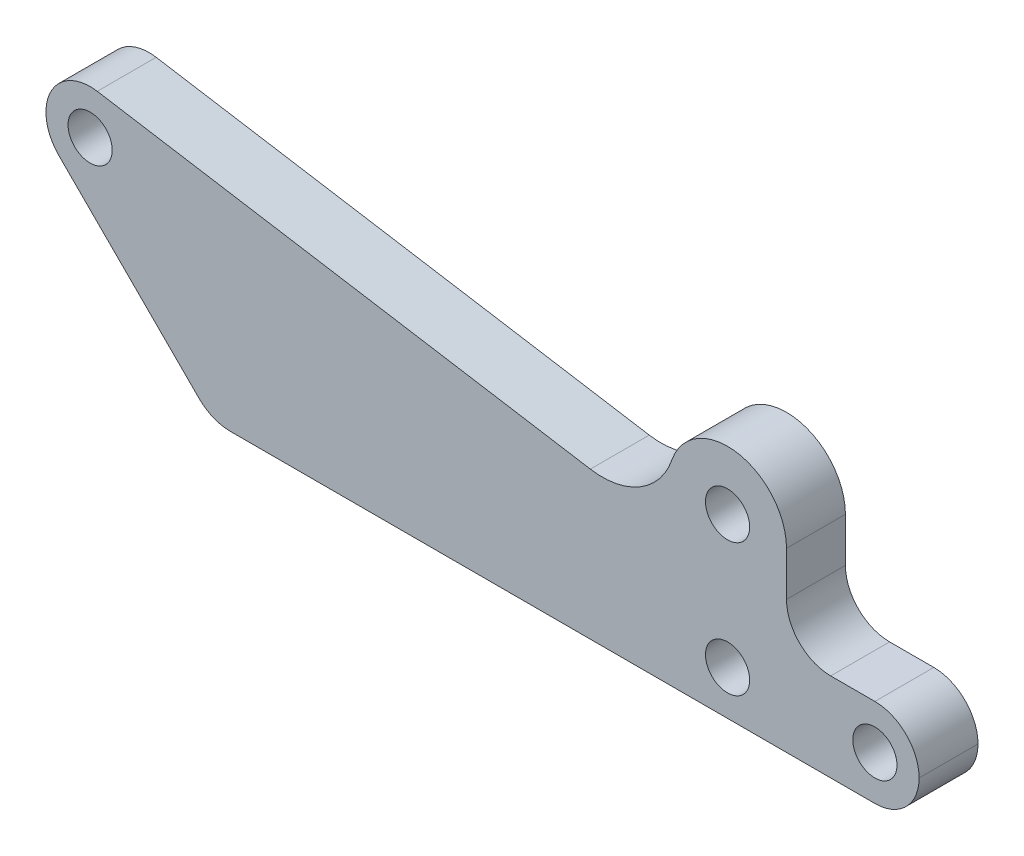
ISO-10303-21;
HEADER;
FILE_DESCRIPTION(('STEP AP214'),'2;1');
FILE_NAME('part.step','',(''),(''),'','','');
FILE_SCHEMA(('AUTOMOTIVE_DESIGN { 1 0 10303 214 1 1 1 1 }'));
ENDSEC;
DATA;
#1=APPLICATION_CONTEXT('core data for automotive mechanical design processes');
#2=APPLICATION_PROTOCOL_DEFINITION('international standard','automotive_design',2000,#1);
#3=PRODUCT_CONTEXT('',#1,'mechanical');
#4=PRODUCT('Part','Part','',(#3));
#5=PRODUCT_RELATED_PRODUCT_CATEGORY('part','',(#4));
#6=PRODUCT_DEFINITION_FORMATION('','',#4);
#7=PRODUCT_DEFINITION_CONTEXT('part definition',#1,'design');
#8=PRODUCT_DEFINITION('design','',#6,#7);
#9=PRODUCT_DEFINITION_SHAPE('','',#8);
#10=(LENGTH_UNIT() NAMED_UNIT(*) SI_UNIT(.MILLI.,.METRE.));
#11=(NAMED_UNIT(*) PLANE_ANGLE_UNIT() SI_UNIT($,.RADIAN.));
#12=(NAMED_UNIT(*) SI_UNIT($,.STERADIAN.) SOLID_ANGLE_UNIT());
#13=UNCERTAINTY_MEASURE_WITH_UNIT(LENGTH_MEASURE(1.E-05),#10,'distance_accuracy_value','');
#14=(GEOMETRIC_REPRESENTATION_CONTEXT(3) GLOBAL_UNCERTAINTY_ASSIGNED_CONTEXT((#13)) GLOBAL_UNIT_ASSIGNED_CONTEXT((#10,
#11,#12)) REPRESENTATION_CONTEXT('',''));
#15=CARTESIAN_POINT('',(0.,0.,0.));
#16=DIRECTION('',(0.,0.,1.));
#17=DIRECTION('',(1.,0.,0.));
#18=AXIS2_PLACEMENT_3D('',#15,#16,#17);
#19=CARTESIAN_POINT('',(-8.27098450185369,12.5136251889729,4.));
#20=DIRECTION('',(0.,0.,-1.));
#21=DIRECTION('',(-1.,0.,0.));
#22=AXIS2_PLACEMENT_3D('',#19,#20,#21);
#23=PLANE('',#22);
#24=DIRECTION('',(1.,0.,0.));
#25=VECTOR('',#24,1.);
#26=CARTESIAN_POINT('',(0.,0.,4.));
#27=LINE('',#26,#25);
#28=CARTESIAN_POINT('',(1.24264068711927,0.,4.));
#29=VERTEX_POINT('',#28);
#30=CARTESIAN_POINT('',(45.,0.,4.));
#31=VERTEX_POINT('',#30);
#32=EDGE_CURVE('E280',#29,#31,#27,.T.);
#33=ORIENTED_EDGE('',*,*,#32,.T.);
#34=CARTESIAN_POINT('',(45.,3.,4.));
#35=DIRECTION('',(0.,0.,-1.));
#36=DIRECTION('',(-1.,0.,0.));
#37=AXIS2_PLACEMENT_3D('',#34,#35,#36);
#38=CIRCLE('',#37,3.);
#39=CARTESIAN_POINT('',(48.,3.,4.));
#40=VERTEX_POINT('',#39);
#41=EDGE_CURVE('E198',#31,#40,#38,.F.);
#42=ORIENTED_EDGE('',*,*,#41,.T.);
#43=CARTESIAN_POINT('',(45.,3.,4.));
#44=DIRECTION('',(0.,0.,-1.));
#45=DIRECTION('',(-1.,0.,0.));
#46=AXIS2_PLACEMENT_3D('',#43,#44,#45);
#47=CIRCLE('',#46,3.);
#48=CARTESIAN_POINT('',(45.,6.,4.));
#49=VERTEX_POINT('',#48);
#50=EDGE_CURVE('E196',#40,#49,#47,.F.);
#51=ORIENTED_EDGE('',*,*,#50,.T.);
#52=DIRECTION('',(-1.,0.,0.));
#53=VECTOR('',#52,1.);
#54=CARTESIAN_POINT('',(39.,6.,4.));
#55=LINE('',#54,#53);
#56=CARTESIAN_POINT('',(42.,6.,4.));
#57=VERTEX_POINT('',#56);
#58=EDGE_CURVE('E130',#49,#57,#55,.T.);
#59=ORIENTED_EDGE('',*,*,#58,.T.);
#60=CARTESIAN_POINT('',(42.,9.,4.));
#61=DIRECTION('',(0.,0.,-1.));
#62=DIRECTION('',(-1.,0.,0.));
#63=AXIS2_PLACEMENT_3D('',#60,#61,#62);
#64=CIRCLE('',#63,3.);
#65=CARTESIAN_POINT('',(39.,9.,4.));
#66=VERTEX_POINT('',#65);
#67=EDGE_CURVE('E11',#57,#66,#64,.T.);
#68=ORIENTED_EDGE('',*,*,#67,.T.);
#69=DIRECTION('',(0.,1.,0.));
#70=VECTOR('',#69,1.);
#71=CARTESIAN_POINT('',(39.,6.,4.));
#72=LINE('',#71,#70);
#73=CARTESIAN_POINT('',(39.,12.,4.));
#74=VERTEX_POINT('',#73);
#75=EDGE_CURVE('E120',#66,#74,#72,.T.);
#76=ORIENTED_EDGE('',*,*,#75,.T.);
#77=CARTESIAN_POINT('',(35.,12.,4.));
#78=DIRECTION('',(0.,0.,1.));
#79=DIRECTION('',(-1.,0.,0.));
#80=AXIS2_PLACEMENT_3D('',#77,#78,#79);
#81=CIRCLE('',#80,4.);
#82=CARTESIAN_POINT('',(31.2185884329908,13.3041957525193,4.));
#83=VERTEX_POINT('',#82);
#84=EDGE_CURVE('E125',#74,#83,#81,.T.);
#85=ORIENTED_EDGE('',*,*,#84,.T.);
#86=CARTESIAN_POINT('',(26.4918239742295,14.9344404431683,4.));
#87=DIRECTION('',(0.,0.,-1.));
#88=DIRECTION('',(1.,0.,0.));
#89=AXIS2_PLACEMENT_3D('',#86,#87,#88);
#90=CIRCLE('',#89,4.99999999999986);
#91=CARTESIAN_POINT('',(25.6847939172777,10.,4.));
#92=VERTEX_POINT('',#91);
#93=EDGE_CURVE('E145',#83,#92,#90,.T.);
#94=ORIENTED_EDGE('',*,*,#93,.T.);
#95=DIRECTION('',(-0.986888088633688,0.161406011390361,0.));
#96=VECTOR('',#95,1.);
#97=CARTESIAN_POINT('',(-7.78676646768261,15.4742894548739,4.));
#98=LINE('',#97,#96);
#99=CARTESIAN_POINT('',(-7.78676646768261,15.4742894548739,4.));
#100=VERTEX_POINT('',#99);
#101=EDGE_CURVE('E147',#92,#100,#98,.T.);
#102=ORIENTED_EDGE('',*,*,#101,.T.);
#103=CARTESIAN_POINT('',(-8.27098450185369,12.5136251889729,4.));
#104=DIRECTION('',(0.,0.,1.));
#105=DIRECTION('',(-1.,0.,0.));
#106=AXIS2_PLACEMENT_3D('',#103,#104,#105);
#107=CIRCLE('',#106,3.);
#108=CARTESIAN_POINT('',(-10.3923048454133,10.3923048454132,4.));
#109=VERTEX_POINT('',#108);
#110=EDGE_CURVE('E152',#100,#109,#107,.T.);
#111=ORIENTED_EDGE('',*,*,#110,.T.);
#112=DIRECTION('',(0.707106781186552,-0.707106781186543,0.));
#113=VECTOR('',#112,1.);
#114=CARTESIAN_POINT('',(0.,0.,4.));
#115=LINE('',#114,#113);
#116=CARTESIAN_POINT('',(-0.878679656440355,0.878679656440345,4.));
#117=VERTEX_POINT('',#116);
#118=EDGE_CURVE('E173',#109,#117,#115,.T.);
#119=ORIENTED_EDGE('',*,*,#118,.T.);
#120=CARTESIAN_POINT('',(1.24264068711927,3.,4.));
#121=DIRECTION('',(0.,0.,-1.));
#122=DIRECTION('',(-1.,0.,0.));
#123=AXIS2_PLACEMENT_3D('',#120,#121,#122);
#124=CIRCLE('',#123,3.);
#125=EDGE_CURVE('E194',#117,#29,#124,.F.);
#126=ORIENTED_EDGE('',*,*,#125,.T.);
#127=EDGE_LOOP('',(#33,#42,#51,#59,#68,#76,#85,#94,#102,#111,#119,#126));
#128=FACE_BOUND('',#127,.T.);
#129=CARTESIAN_POINT('',(35.,12.,4.));
#130=DIRECTION('',(0.,0.,1.));
#131=DIRECTION('',(1.,0.,0.));
#132=AXIS2_PLACEMENT_3D('',#129,#130,#131);
#133=CIRCLE('',#132,1.5);
#134=CARTESIAN_POINT('',(36.5,12.,4.));
#135=VERTEX_POINT('',#134);
#136=EDGE_CURVE('E159',#135,#135,#133,.T.);
#137=ORIENTED_EDGE('',*,*,#136,.F.);
#138=EDGE_LOOP('',(#137));
#139=FACE_BOUND('',#138,.T.);
#140=CARTESIAN_POINT('',(-8.27098450185369,12.5136251889729,4.));
#141=DIRECTION('',(0.,0.,1.));
#142=DIRECTION('',(1.,0.,0.));
#143=AXIS2_PLACEMENT_3D('',#140,#141,#142);
#144=CIRCLE('',#143,1.50000000000001);
#145=CARTESIAN_POINT('',(-6.77098450185369,12.5136251889729,4.));
#146=VERTEX_POINT('',#145);
#147=EDGE_CURVE('E289',#146,#146,#144,.T.);
#148=ORIENTED_EDGE('',*,*,#147,.F.);
#149=EDGE_LOOP('',(#148));
#150=FACE_BOUND('',#149,.T.);
#151=CARTESIAN_POINT('',(35.,3.,4.));
#152=DIRECTION('',(0.,0.,1.));
#153=DIRECTION('',(1.,0.,0.));
#154=AXIS2_PLACEMENT_3D('',#151,#152,#153);
#155=CIRCLE('',#154,1.5);
#156=CARTESIAN_POINT('',(36.5,3.,4.));
#157=VERTEX_POINT('',#156);
#158=EDGE_CURVE('E295',#157,#157,#155,.T.);
#159=ORIENTED_EDGE('',*,*,#158,.F.);
#160=EDGE_LOOP('',(#159));
#161=FACE_BOUND('',#160,.T.);
#162=CARTESIAN_POINT('',(45.,3.,4.));
#163=DIRECTION('',(0.,0.,1.));
#164=DIRECTION('',(1.,0.,0.));
#165=AXIS2_PLACEMENT_3D('',#162,#163,#164);
#166=CIRCLE('',#165,1.5);
#167=CARTESIAN_POINT('',(46.5,3.,4.));
#168=VERTEX_POINT('',#167);
#169=EDGE_CURVE('E301',#168,#168,#166,.T.);
#170=ORIENTED_EDGE('',*,*,#169,.F.);
#171=EDGE_LOOP('',(#170));
#172=FACE_BOUND('',#171,.T.);
#173=ADVANCED_FACE('F33',(#128,#139,#150,#161,#172),#23,.F.);
#174=CARTESIAN_POINT('',(-8.27098450185369,12.5136251889729,0.));
#175=DIRECTION('',(0.,0.,-1.));
#176=DIRECTION('',(-1.,0.,0.));
#177=AXIS2_PLACEMENT_3D('',#174,#175,#176);
#178=PLANE('',#177);
#179=CARTESIAN_POINT('',(35.,3.,0.));
#180=DIRECTION('',(0.,0.,1.));
#181=DIRECTION('',(1.,0.,0.));
#182=AXIS2_PLACEMENT_3D('',#179,#180,#181);
#183=CIRCLE('',#182,1.5);
#184=CARTESIAN_POINT('',(36.5,3.,0.));
#185=VERTEX_POINT('',#184);
#186=EDGE_CURVE('E298',#185,#185,#183,.T.);
#187=ORIENTED_EDGE('',*,*,#186,.T.);
#188=EDGE_LOOP('',(#187));
#189=FACE_BOUND('',#188,.T.);
#190=CARTESIAN_POINT('',(35.,12.,0.));
#191=DIRECTION('',(0.,0.,1.));
#192=DIRECTION('',(1.,0.,0.));
#193=AXIS2_PLACEMENT_3D('',#190,#191,#192);
#194=CIRCLE('',#193,1.5);
#195=CARTESIAN_POINT('',(36.5,12.,0.));
#196=VERTEX_POINT('',#195);
#197=EDGE_CURVE('E286',#196,#196,#194,.T.);
#198=ORIENTED_EDGE('',*,*,#197,.T.);
#199=EDGE_LOOP('',(#198));
#200=FACE_BOUND('',#199,.T.);
#201=CARTESIAN_POINT('',(45.,3.,0.));
#202=DIRECTION('',(0.,0.,-1.));
#203=DIRECTION('',(-1.,0.,0.));
#204=AXIS2_PLACEMENT_3D('',#201,#202,#203);
#205=CIRCLE('',#204,3.);
#206=CARTESIAN_POINT('',(45.,6.,0.));
#207=VERTEX_POINT('',#206);
#208=CARTESIAN_POINT('',(48.,3.,0.));
#209=VERTEX_POINT('',#208);
#210=EDGE_CURVE('E184',#207,#209,#205,.T.);
#211=ORIENTED_EDGE('',*,*,#210,.T.);
#212=CARTESIAN_POINT('',(45.,3.,0.));
#213=DIRECTION('',(0.,0.,-1.));
#214=DIRECTION('',(-1.,0.,0.));
#215=AXIS2_PLACEMENT_3D('',#212,#213,#214);
#216=CIRCLE('',#215,3.);
#217=CARTESIAN_POINT('',(45.,0.,0.));
#218=VERTEX_POINT('',#217);
#219=EDGE_CURVE('E186',#209,#218,#216,.T.);
#220=ORIENTED_EDGE('',*,*,#219,.T.);
#221=DIRECTION('',(1.,0.,0.));
#222=VECTOR('',#221,1.);
#223=CARTESIAN_POINT('',(0.,0.,0.));
#224=LINE('',#223,#222);
#225=CARTESIAN_POINT('',(1.24264068711927,0.,0.));
#226=VERTEX_POINT('',#225);
#227=EDGE_CURVE('E158',#226,#218,#224,.T.);
#228=ORIENTED_EDGE('',*,*,#227,.F.);
#229=CARTESIAN_POINT('',(1.24264068711927,3.,0.));
#230=DIRECTION('',(0.,0.,-1.));
#231=DIRECTION('',(-1.,0.,0.));
#232=AXIS2_PLACEMENT_3D('',#229,#230,#231);
#233=CIRCLE('',#232,3.);
#234=CARTESIAN_POINT('',(-0.878679656440355,0.878679656440345,0.));
#235=VERTEX_POINT('',#234);
#236=EDGE_CURVE('E139',#226,#235,#233,.T.);
#237=ORIENTED_EDGE('',*,*,#236,.T.);
#238=DIRECTION('',(0.707106781186552,-0.707106781186543,0.));
#239=VECTOR('',#238,1.);
#240=CARTESIAN_POINT('',(0.,0.,0.));
#241=LINE('',#240,#239);
#242=CARTESIAN_POINT('',(-10.3923048454133,10.3923048454132,0.));
#243=VERTEX_POINT('',#242);
#244=EDGE_CURVE('E155',#243,#235,#241,.T.);
#245=ORIENTED_EDGE('',*,*,#244,.F.);
#246=CARTESIAN_POINT('',(-8.27098450185369,12.5136251889729,0.));
#247=DIRECTION('',(0.,0.,1.));
#248=DIRECTION('',(-1.,0.,0.));
#249=AXIS2_PLACEMENT_3D('',#246,#247,#248);
#250=CIRCLE('',#249,3.);
#251=CARTESIAN_POINT('',(-7.78676646768261,15.4742894548739,0.));
#252=VERTEX_POINT('',#251);
#253=EDGE_CURVE('E171',#252,#243,#250,.T.);
#254=ORIENTED_EDGE('',*,*,#253,.F.);
#255=DIRECTION('',(-0.986888088633688,0.161406011390361,0.));
#256=VECTOR('',#255,1.);
#257=CARTESIAN_POINT('',(-7.78676646768261,15.4742894548739,0.));
#258=LINE('',#257,#256);
#259=CARTESIAN_POINT('',(25.6847939172777,10.,0.));
#260=VERTEX_POINT('',#259);
#261=EDGE_CURVE('E169',#260,#252,#258,.T.);
#262=ORIENTED_EDGE('',*,*,#261,.F.);
#263=CARTESIAN_POINT('',(26.4918239742295,14.9344404431683,0.));
#264=DIRECTION('',(0.,0.,-1.));
#265=DIRECTION('',(1.,0.,0.));
#266=AXIS2_PLACEMENT_3D('',#263,#264,#265);
#267=CIRCLE('',#266,4.99999999999986);
#268=CARTESIAN_POINT('',(31.2185884329908,13.3041957525193,0.));
#269=VERTEX_POINT('',#268);
#270=EDGE_CURVE('E167',#269,#260,#267,.T.);
#271=ORIENTED_EDGE('',*,*,#270,.F.);
#272=CARTESIAN_POINT('',(35.,12.,0.));
#273=DIRECTION('',(0.,0.,1.));
#274=DIRECTION('',(-1.,0.,0.));
#275=AXIS2_PLACEMENT_3D('',#272,#273,#274);
#276=CIRCLE('',#275,4.);
#277=CARTESIAN_POINT('',(39.,12.,0.));
#278=VERTEX_POINT('',#277);
#279=EDGE_CURVE('E165',#278,#269,#276,.T.);
#280=ORIENTED_EDGE('',*,*,#279,.F.);
#281=DIRECTION('',(0.,1.,0.));
#282=VECTOR('',#281,1.);
#283=CARTESIAN_POINT('',(39.,6.,0.));
#284=LINE('',#283,#282);
#285=CARTESIAN_POINT('',(39.,9.,0.));
#286=VERTEX_POINT('',#285);
#287=EDGE_CURVE('E136',#286,#278,#284,.T.);
#288=ORIENTED_EDGE('',*,*,#287,.F.);
#289=CARTESIAN_POINT('',(42.,9.,0.));
#290=DIRECTION('',(0.,0.,-1.));
#291=DIRECTION('',(-1.,0.,0.));
#292=AXIS2_PLACEMENT_3D('',#289,#290,#291);
#293=CIRCLE('',#292,3.);
#294=CARTESIAN_POINT('',(42.,6.,0.));
#295=VERTEX_POINT('',#294);
#296=EDGE_CURVE('E42',#286,#295,#293,.F.);
#297=ORIENTED_EDGE('',*,*,#296,.T.);
#298=DIRECTION('',(-1.,0.,0.));
#299=VECTOR('',#298,1.);
#300=CARTESIAN_POINT('',(39.,6.,0.));
#301=LINE('',#300,#299);
#302=EDGE_CURVE('E162',#207,#295,#301,.T.);
#303=ORIENTED_EDGE('',*,*,#302,.F.);
#304=EDGE_LOOP('',(#211,#220,#228,#237,#245,#254,#262,#271,#280,#288,#297,#303));
#305=FACE_BOUND('',#304,.T.);
#306=CARTESIAN_POINT('',(-8.27098450185369,12.5136251889729,0.));
#307=DIRECTION('',(0.,0.,1.));
#308=DIRECTION('',(1.,0.,0.));
#309=AXIS2_PLACEMENT_3D('',#306,#307,#308);
#310=CIRCLE('',#309,1.50000000000001);
#311=CARTESIAN_POINT('',(-6.77098450185369,12.5136251889729,0.));
#312=VERTEX_POINT('',#311);
#313=EDGE_CURVE('E292',#312,#312,#310,.T.);
#314=ORIENTED_EDGE('',*,*,#313,.T.);
#315=EDGE_LOOP('',(#314));
#316=FACE_BOUND('',#315,.T.);
#317=CARTESIAN_POINT('',(45.,3.,0.));
#318=DIRECTION('',(0.,0.,1.));
#319=DIRECTION('',(1.,0.,0.));
#320=AXIS2_PLACEMENT_3D('',#317,#318,#319);
#321=CIRCLE('',#320,1.5);
#322=CARTESIAN_POINT('',(46.5,3.,0.));
#323=VERTEX_POINT('',#322);
#324=EDGE_CURVE('E304',#323,#323,#321,.T.);
#325=ORIENTED_EDGE('',*,*,#324,.T.);
#326=EDGE_LOOP('',(#325));
#327=FACE_BOUND('',#326,.T.);
#328=ADVANCED_FACE('F209',(#189,#200,#305,#316,#327),#178,.T.);
#329=CARTESIAN_POINT('',(0.,0.,4.));
#330=DIRECTION('',(0.707106781186543,0.707106781186552,0.));
#331=DIRECTION('',(-0.707106781186552,0.707106781186543,0.));
#332=AXIS2_PLACEMENT_3D('',#329,#330,#331);
#333=PLANE('',#332);
#334=ORIENTED_EDGE('',*,*,#244,.T.);
#335=DIRECTION('',(0.,0.,-1.));
#336=VECTOR('',#335,1.);
#337=CARTESIAN_POINT('',(-0.878679656440355,0.878679656440345,4.));
#338=LINE('',#337,#336);
#339=EDGE_CURVE('E205',#235,#117,#338,.F.);
#340=ORIENTED_EDGE('',*,*,#339,.T.);
#341=ORIENTED_EDGE('',*,*,#118,.F.);
#342=DIRECTION('',(0.,0.,-1.));
#343=VECTOR('',#342,1.);
#344=CARTESIAN_POINT('',(-10.3923048454133,10.3923048454132,4.));
#345=LINE('',#344,#343);
#346=EDGE_CURVE('E154',#109,#243,#345,.T.);
#347=ORIENTED_EDGE('',*,*,#346,.T.);
#348=EDGE_LOOP('',(#334,#340,#341,#347));
#349=FACE_BOUND('',#348,.T.);
#350=ADVANCED_FACE('F232',(#349),#333,.F.);
#351=CARTESIAN_POINT('',(0.,0.,4.));
#352=DIRECTION('',(0.,1.,0.));
#353=DIRECTION('',(0.,0.,1.));
#354=AXIS2_PLACEMENT_3D('',#351,#352,#353);
#355=PLANE('',#354);
#356=ORIENTED_EDGE('',*,*,#227,.T.);
#357=DIRECTION('',(0.,0.,-1.));
#358=VECTOR('',#357,1.);
#359=CARTESIAN_POINT('',(45.,0.,4.));
#360=LINE('',#359,#358);
#361=EDGE_CURVE('E191',#218,#31,#360,.F.);
#362=ORIENTED_EDGE('',*,*,#361,.T.);
#363=ORIENTED_EDGE('',*,*,#32,.F.);
#364=DIRECTION('',(0.,0.,-1.));
#365=VECTOR('',#364,1.);
#366=CARTESIAN_POINT('',(1.24264068711927,0.,4.));
#367=LINE('',#366,#365);
#368=EDGE_CURVE('E188',#29,#226,#367,.T.);
#369=ORIENTED_EDGE('',*,*,#368,.T.);
#370=EDGE_LOOP('',(#356,#362,#363,#369));
#371=FACE_BOUND('',#370,.T.);
#372=ADVANCED_FACE('F257',(#371),#355,.F.);
#373=CARTESIAN_POINT('',(39.,6.,4.));
#374=DIRECTION('',(0.,-1.,0.));
#375=DIRECTION('',(0.,0.,-1.));
#376=AXIS2_PLACEMENT_3D('',#373,#374,#375);
#377=PLANE('',#376);
#378=ORIENTED_EDGE('',*,*,#58,.F.);
#379=DIRECTION('',(0.,0.,-1.));
#380=VECTOR('',#379,1.);
#381=CARTESIAN_POINT('',(45.,6.,4.));
#382=LINE('',#381,#380);
#383=EDGE_CURVE('E201',#49,#207,#382,.T.);
#384=ORIENTED_EDGE('',*,*,#383,.T.);
#385=ORIENTED_EDGE('',*,*,#302,.T.);
#386=DIRECTION('',(0.,0.,-1.));
#387=VECTOR('',#386,1.);
#388=CARTESIAN_POINT('',(42.,6.,4.));
#389=LINE('',#388,#387);
#390=EDGE_CURVE('E55',#295,#57,#389,.F.);
#391=ORIENTED_EDGE('',*,*,#390,.T.);
#392=EDGE_LOOP('',(#378,#384,#385,#391));
#393=FACE_BOUND('',#392,.T.);
#394=ADVANCED_FACE('F213',(#393),#377,.F.);
#395=CARTESIAN_POINT('',(39.,6.,4.));
#396=DIRECTION('',(-1.,0.,0.));
#397=DIRECTION('',(0.,-1.,0.));
#398=AXIS2_PLACEMENT_3D('',#395,#396,#397);
#399=PLANE('',#398);
#400=ORIENTED_EDGE('',*,*,#75,.F.);
#401=DIRECTION('',(0.,0.,-1.));
#402=VECTOR('',#401,1.);
#403=CARTESIAN_POINT('',(39.,9.,0.));
#404=LINE('',#403,#402);
#405=EDGE_CURVE('E203',#66,#286,#404,.T.);
#406=ORIENTED_EDGE('',*,*,#405,.T.);
#407=ORIENTED_EDGE('',*,*,#287,.T.);
#408=DIRECTION('',(0.,0.,-1.));
#409=VECTOR('',#408,1.);
#410=CARTESIAN_POINT('',(39.,12.,4.));
#411=LINE('',#410,#409);
#412=EDGE_CURVE('E133',#74,#278,#411,.T.);
#413=ORIENTED_EDGE('',*,*,#412,.F.);
#414=EDGE_LOOP('',(#400,#406,#407,#413));
#415=FACE_BOUND('',#414,.T.);
#416=ADVANCED_FACE('F134',(#415),#399,.F.);
#417=CARTESIAN_POINT('',(35.,12.,4.));
#418=DIRECTION('',(0.,0.,-1.));
#419=DIRECTION('',(-1.,0.,0.));
#420=AXIS2_PLACEMENT_3D('',#417,#418,#419);
#421=CYLINDRICAL_SURFACE('',#420,4.);
#422=ORIENTED_EDGE('',*,*,#279,.T.);
#423=DIRECTION('',(0.,0.,-1.));
#424=VECTOR('',#423,1.);
#425=CARTESIAN_POINT('',(31.2185884329908,13.3041957525193,4.));
#426=LINE('',#425,#424);
#427=EDGE_CURVE('E140',#83,#269,#426,.T.);
#428=ORIENTED_EDGE('',*,*,#427,.F.);
#429=ORIENTED_EDGE('',*,*,#84,.F.);
#430=ORIENTED_EDGE('',*,*,#412,.T.);
#431=EDGE_LOOP('',(#422,#428,#429,#430));
#432=FACE_BOUND('',#431,.T.);
#433=ADVANCED_FACE('F142',(#432),#421,.T.);
#434=CARTESIAN_POINT('',(26.4918239742295,14.9344404431683,4.));
#435=DIRECTION('',(0.,0.,-1.));
#436=DIRECTION('',(-1.,0.,0.));
#437=AXIS2_PLACEMENT_3D('',#434,#435,#436);
#438=CYLINDRICAL_SURFACE('',#437,4.99999999999986);
#439=ORIENTED_EDGE('',*,*,#270,.T.);
#440=DIRECTION('',(0.,0.,-1.));
#441=VECTOR('',#440,1.);
#442=CARTESIAN_POINT('',(25.6847939172777,10.,4.));
#443=LINE('',#442,#441);
#444=EDGE_CURVE('E179',#92,#260,#443,.T.);
#445=ORIENTED_EDGE('',*,*,#444,.F.);
#446=ORIENTED_EDGE('',*,*,#93,.F.);
#447=ORIENTED_EDGE('',*,*,#427,.T.);
#448=EDGE_LOOP('',(#439,#445,#446,#447));
#449=FACE_BOUND('',#448,.T.);
#450=ADVANCED_FACE('F246',(#449),#438,.F.);
#451=CARTESIAN_POINT('',(-7.78676646768261,15.4742894548739,4.));
#452=DIRECTION('',(-0.161406011390361,-0.986888088633688,0.));
#453=DIRECTION('',(0.986888088633688,-0.161406011390361,0.));
#454=AXIS2_PLACEMENT_3D('',#451,#452,#453);
#455=PLANE('',#454);
#456=ORIENTED_EDGE('',*,*,#261,.T.);
#457=DIRECTION('',(0.,0.,-1.));
#458=VECTOR('',#457,1.);
#459=CARTESIAN_POINT('',(-7.78676646768261,15.4742894548739,4.));
#460=LINE('',#459,#458);
#461=EDGE_CURVE('E176',#100,#252,#460,.T.);
#462=ORIENTED_EDGE('',*,*,#461,.F.);
#463=ORIENTED_EDGE('',*,*,#101,.F.);
#464=ORIENTED_EDGE('',*,*,#444,.T.);
#465=EDGE_LOOP('',(#456,#462,#463,#464));
#466=FACE_BOUND('',#465,.T.);
#467=ADVANCED_FACE('F242',(#466),#455,.F.);
#468=CARTESIAN_POINT('',(-8.27098450185369,12.5136251889729,4.));
#469=DIRECTION('',(0.,0.,-1.));
#470=DIRECTION('',(-1.,0.,0.));
#471=AXIS2_PLACEMENT_3D('',#468,#469,#470);
#472=CYLINDRICAL_SURFACE('',#471,3.);
#473=ORIENTED_EDGE('',*,*,#253,.T.);
#474=ORIENTED_EDGE('',*,*,#346,.F.);
#475=ORIENTED_EDGE('',*,*,#110,.F.);
#476=ORIENTED_EDGE('',*,*,#461,.T.);
#477=EDGE_LOOP('',(#473,#474,#475,#476));
#478=FACE_BOUND('',#477,.T.);
#479=ADVANCED_FACE('F239',(#478),#472,.T.);
#480=CARTESIAN_POINT('',(35.,12.,4.));
#481=DIRECTION('',(0.,0.,-1.));
#482=DIRECTION('',(-1.,0.,0.));
#483=AXIS2_PLACEMENT_3D('',#480,#481,#482);
#484=CYLINDRICAL_SURFACE('',#483,1.5);
#485=ORIENTED_EDGE('',*,*,#136,.T.);
#486=EDGE_LOOP('',(#485));
#487=FACE_BOUND('',#486,.T.);
#488=ORIENTED_EDGE('',*,*,#197,.F.);
#489=EDGE_LOOP('',(#488));
#490=FACE_BOUND('',#489,.T.);
#491=ADVANCED_FACE('F236',(#487,#490),#484,.F.);
#492=CARTESIAN_POINT('',(-8.27098450185369,12.5136251889729,4.));
#493=DIRECTION('',(0.,0.,-1.));
#494=DIRECTION('',(-1.,0.,0.));
#495=AXIS2_PLACEMENT_3D('',#492,#493,#494);
#496=CYLINDRICAL_SURFACE('',#495,1.50000000000001);
#497=ORIENTED_EDGE('',*,*,#147,.T.);
#498=EDGE_LOOP('',(#497));
#499=FACE_BOUND('',#498,.T.);
#500=ORIENTED_EDGE('',*,*,#313,.F.);
#501=EDGE_LOOP('',(#500));
#502=FACE_BOUND('',#501,.T.);
#503=ADVANCED_FACE('F318',(#499,#502),#496,.F.);
#504=CARTESIAN_POINT('',(35.,3.,4.));
#505=DIRECTION('',(0.,0.,-1.));
#506=DIRECTION('',(-1.,0.,0.));
#507=AXIS2_PLACEMENT_3D('',#504,#505,#506);
#508=CYLINDRICAL_SURFACE('',#507,1.5);
#509=ORIENTED_EDGE('',*,*,#158,.T.);
#510=EDGE_LOOP('',(#509));
#511=FACE_BOUND('',#510,.T.);
#512=ORIENTED_EDGE('',*,*,#186,.F.);
#513=EDGE_LOOP('',(#512));
#514=FACE_BOUND('',#513,.T.);
#515=ADVANCED_FACE('F269',(#511,#514),#508,.F.);
#516=CARTESIAN_POINT('',(45.,3.,4.));
#517=DIRECTION('',(0.,0.,-1.));
#518=DIRECTION('',(-1.,0.,0.));
#519=AXIS2_PLACEMENT_3D('',#516,#517,#518);
#520=CYLINDRICAL_SURFACE('',#519,1.5);
#521=ORIENTED_EDGE('',*,*,#169,.T.);
#522=EDGE_LOOP('',(#521));
#523=FACE_BOUND('',#522,.T.);
#524=ORIENTED_EDGE('',*,*,#324,.F.);
#525=EDGE_LOOP('',(#524));
#526=FACE_BOUND('',#525,.T.);
#527=ADVANCED_FACE('F264',(#523,#526),#520,.F.);
#528=CARTESIAN_POINT('',(45.,3.,4.));
#529=DIRECTION('',(0.,0.,-1.));
#530=DIRECTION('',(-1.,0.,0.));
#531=AXIS2_PLACEMENT_3D('',#528,#529,#530);
#532=CYLINDRICAL_SURFACE('',#531,3.);
#533=ORIENTED_EDGE('',*,*,#383,.F.);
#534=ORIENTED_EDGE('',*,*,#50,.F.);
#535=DIRECTION('',(0.,0.,-1.));
#536=VECTOR('',#535,1.);
#537=CARTESIAN_POINT('',(48.,3.,4.));
#538=LINE('',#537,#536);
#539=EDGE_CURVE('E37',#209,#40,#538,.F.);
#540=ORIENTED_EDGE('',*,*,#539,.F.);
#541=ORIENTED_EDGE('',*,*,#210,.F.);
#542=EDGE_LOOP('',(#533,#534,#540,#541));
#543=FACE_BOUND('',#542,.T.);
#544=ADVANCED_FACE('F223',(#543),#532,.T.);
#545=CARTESIAN_POINT('',(45.,3.,4.));
#546=DIRECTION('',(0.,0.,-1.));
#547=DIRECTION('',(-1.,0.,0.));
#548=AXIS2_PLACEMENT_3D('',#545,#546,#547);
#549=CYLINDRICAL_SURFACE('',#548,3.);
#550=ORIENTED_EDGE('',*,*,#41,.F.);
#551=ORIENTED_EDGE('',*,*,#361,.F.);
#552=ORIENTED_EDGE('',*,*,#219,.F.);
#553=ORIENTED_EDGE('',*,*,#539,.T.);
#554=EDGE_LOOP('',(#550,#551,#552,#553));
#555=FACE_BOUND('',#554,.T.);
#556=ADVANCED_FACE('F217',(#555),#549,.T.);
#557=CARTESIAN_POINT('',(42.,9.,4.));
#558=DIRECTION('',(0.,0.,1.));
#559=DIRECTION('',(1.,0.,0.));
#560=AXIS2_PLACEMENT_3D('',#557,#558,#559);
#561=CYLINDRICAL_SURFACE('',#560,3.);
#562=ORIENTED_EDGE('',*,*,#67,.F.);
#563=ORIENTED_EDGE('',*,*,#390,.F.);
#564=ORIENTED_EDGE('',*,*,#296,.F.);
#565=ORIENTED_EDGE('',*,*,#405,.F.);
#566=EDGE_LOOP('',(#562,#563,#564,#565));
#567=FACE_BOUND('',#566,.T.);
#568=ADVANCED_FACE('F215',(#567),#561,.F.);
#569=CARTESIAN_POINT('',(1.24264068711927,3.,4.));
#570=DIRECTION('',(0.,0.,-1.));
#571=DIRECTION('',(-1.,0.,0.));
#572=AXIS2_PLACEMENT_3D('',#569,#570,#571);
#573=CYLINDRICAL_SURFACE('',#572,3.);
#574=ORIENTED_EDGE('',*,*,#125,.F.);
#575=ORIENTED_EDGE('',*,*,#339,.F.);
#576=ORIENTED_EDGE('',*,*,#236,.F.);
#577=ORIENTED_EDGE('',*,*,#368,.F.);
#578=EDGE_LOOP('',(#574,#575,#576,#577));
#579=FACE_BOUND('',#578,.T.);
#580=ADVANCED_FACE('F35',(#579),#573,.T.);
#581=CLOSED_SHELL('',(#173,#328,#350,#372,#394,#416,#433,#450,#467,#479,#491,#503,#515,#527,
#544,#556,#568,#580));
#582=MANIFOLD_SOLID_BREP('B2',#581);
#583=ADVANCED_BREP_SHAPE_REPRESENTATION('',(#18,#582),#14);
#584=SHAPE_DEFINITION_REPRESENTATION(#9,#583);
ENDSEC;
END-ISO-10303-21;
